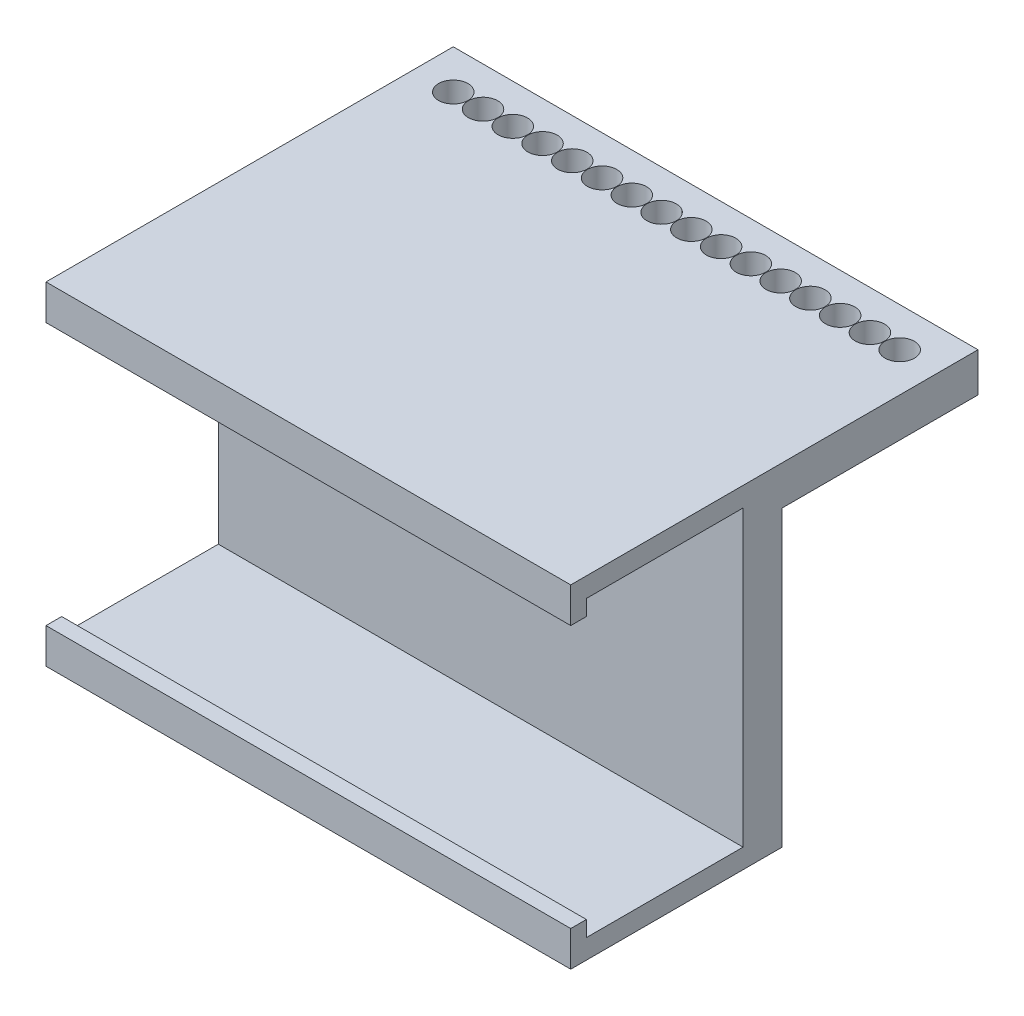
ISO-10303-21;
HEADER;
FILE_DESCRIPTION(('STEP AP214'),'2;1');
FILE_NAME('part.step','',(''),(''),'','','');
FILE_SCHEMA(('AUTOMOTIVE_DESIGN { 1 0 10303 214 1 1 1 1 }'));
ENDSEC;
DATA;
#1=APPLICATION_CONTEXT('core data for automotive mechanical design processes');
#2=APPLICATION_PROTOCOL_DEFINITION('international standard','automotive_design',2000,#1);
#3=PRODUCT_CONTEXT('',#1,'mechanical');
#4=PRODUCT('Part','Part','',(#3));
#5=PRODUCT_RELATED_PRODUCT_CATEGORY('part','',(#4));
#6=PRODUCT_DEFINITION_FORMATION('','',#4);
#7=PRODUCT_DEFINITION_CONTEXT('part definition',#1,'design');
#8=PRODUCT_DEFINITION('design','',#6,#7);
#9=PRODUCT_DEFINITION_SHAPE('','',#8);
#10=(LENGTH_UNIT() NAMED_UNIT(*) SI_UNIT(.MILLI.,.METRE.));
#11=(NAMED_UNIT(*) PLANE_ANGLE_UNIT() SI_UNIT($,.RADIAN.));
#12=(NAMED_UNIT(*) SI_UNIT($,.STERADIAN.) SOLID_ANGLE_UNIT());
#13=UNCERTAINTY_MEASURE_WITH_UNIT(LENGTH_MEASURE(1.E-05),#10,'distance_accuracy_value','');
#14=(GEOMETRIC_REPRESENTATION_CONTEXT(3) GLOBAL_UNCERTAINTY_ASSIGNED_CONTEXT((#13)) GLOBAL_UNIT_ASSIGNED_CONTEXT((#10,
#11,#12)) REPRESENTATION_CONTEXT('',''));
#15=CARTESIAN_POINT('',(0.,0.,0.));
#16=DIRECTION('',(0.,0.,1.));
#17=DIRECTION('',(1.,0.,0.));
#18=AXIS2_PLACEMENT_3D('',#15,#16,#17);
#19=CARTESIAN_POINT('',(-88.3816326530613,6.35,27.6678571428572));
#20=DIRECTION('',(0.,0.,-1.));
#21=DIRECTION('',(-1.,0.,0.));
#22=AXIS2_PLACEMENT_3D('',#19,#20,#21);
#23=PLANE('',#22);
#24=DIRECTION('',(-1.,0.,0.));
#25=VECTOR('',#24,1.);
#26=CARTESIAN_POINT('',(-88.3816326530613,-44.45,27.6678571428572));
#27=LINE('',#26,#25);
#28=CARTESIAN_POINT('',(-3.29163265306134,-44.45,27.6678571428572));
#29=VERTEX_POINT('',#28);
#30=CARTESIAN_POINT('',(-88.3816326530613,-44.45,27.6678571428572));
#31=VERTEX_POINT('',#30);
#32=EDGE_CURVE('E396',#29,#31,#27,.T.);
#33=ORIENTED_EDGE('',*,*,#32,.F.);
#34=DIRECTION('',(0.,-1.,0.));
#35=VECTOR('',#34,1.);
#36=CARTESIAN_POINT('',(-3.29163265306134,6.35,27.6678571428572));
#37=LINE('',#36,#35);
#38=CARTESIAN_POINT('',(-3.29163265306134,3.175,27.6678571428572));
#39=VERTEX_POINT('',#38);
#40=EDGE_CURVE('E48',#39,#29,#37,.T.);
#41=ORIENTED_EDGE('',*,*,#40,.F.);
#42=DIRECTION('',(1.,0.,0.));
#43=VECTOR('',#42,1.);
#44=CARTESIAN_POINT('',(-88.3816326530613,3.175,27.6678571428572));
#45=LINE('',#44,#43);
#46=CARTESIAN_POINT('',(-88.3816326530613,3.175,27.6678571428572));
#47=VERTEX_POINT('',#46);
#48=EDGE_CURVE('E171',#47,#39,#45,.T.);
#49=ORIENTED_EDGE('',*,*,#48,.F.);
#50=DIRECTION('',(0.,-1.,0.));
#51=VECTOR('',#50,1.);
#52=CARTESIAN_POINT('',(-88.3816326530613,6.35,27.6678571428572));
#53=LINE('',#52,#51);
#54=EDGE_CURVE('E11',#47,#31,#53,.T.);
#55=ORIENTED_EDGE('',*,*,#54,.T.);
#56=EDGE_LOOP('',(#33,#41,#49,#55));
#57=FACE_BOUND('',#56,.T.);
#58=ADVANCED_FACE('F39',(#57),#23,.F.);
#59=CARTESIAN_POINT('',(0.,0.,0.));
#60=DIRECTION('',(0.,1.,0.));
#61=DIRECTION('',(0.,0.,1.));
#62=AXIS2_PLACEMENT_3D('',#59,#60,#61);
#63=PLANE('',#62);
#64=CARTESIAN_POINT('',(-9.64163265306134,0.,-4.08214285714284));
#65=DIRECTION('',(0.,1.,0.));
#66=DIRECTION('',(0.,0.,1.));
#67=AXIS2_PLACEMENT_3D('',#64,#65,#66);
#68=CIRCLE('',#67,2.38125000000001);
#69=CARTESIAN_POINT('',(-9.64163265306134,0.,-1.70089285714283));
#70=VERTEX_POINT('',#69);
#71=EDGE_CURVE('E216',#70,#70,#68,.T.);
#72=ORIENTED_EDGE('',*,*,#71,.T.);
#73=EDGE_LOOP('',(#72));
#74=FACE_BOUND('',#73,.T.);
#75=CARTESIAN_POINT('',(-14.4676326530613,0.,-4.08214285714284));
#76=DIRECTION('',(0.,1.,0.));
#77=DIRECTION('',(0.,0.,1.));
#78=AXIS2_PLACEMENT_3D('',#75,#76,#77);
#79=CIRCLE('',#78,2.38125000000001);
#80=CARTESIAN_POINT('',(-14.4676326530613,0.,-1.70089285714283));
#81=VERTEX_POINT('',#80);
#82=EDGE_CURVE('E221',#81,#81,#79,.T.);
#83=ORIENTED_EDGE('',*,*,#82,.T.);
#84=EDGE_LOOP('',(#83));
#85=FACE_BOUND('',#84,.T.);
#86=CARTESIAN_POINT('',(-19.2936326530613,0.,-4.08214285714284));
#87=DIRECTION('',(0.,1.,0.));
#88=DIRECTION('',(0.,0.,1.));
#89=AXIS2_PLACEMENT_3D('',#86,#87,#88);
#90=CIRCLE('',#89,2.38125000000001);
#91=CARTESIAN_POINT('',(-19.2936326530613,0.,-1.70089285714283));
#92=VERTEX_POINT('',#91);
#93=EDGE_CURVE('E229',#92,#92,#90,.T.);
#94=ORIENTED_EDGE('',*,*,#93,.T.);
#95=EDGE_LOOP('',(#94));
#96=FACE_BOUND('',#95,.T.);
#97=CARTESIAN_POINT('',(-24.1196326530613,0.,-4.08214285714284));
#98=DIRECTION('',(0.,1.,0.));
#99=DIRECTION('',(0.,0.,1.));
#100=AXIS2_PLACEMENT_3D('',#97,#98,#99);
#101=CIRCLE('',#100,2.38125000000001);
#102=CARTESIAN_POINT('',(-24.1196326530613,0.,-1.70089285714283));
#103=VERTEX_POINT('',#102);
#104=EDGE_CURVE('E237',#103,#103,#101,.T.);
#105=ORIENTED_EDGE('',*,*,#104,.T.);
#106=EDGE_LOOP('',(#105));
#107=FACE_BOUND('',#106,.T.);
#108=CARTESIAN_POINT('',(-28.9456326530613,0.,-4.08214285714284));
#109=DIRECTION('',(0.,1.,0.));
#110=DIRECTION('',(0.,0.,1.));
#111=AXIS2_PLACEMENT_3D('',#108,#109,#110);
#112=CIRCLE('',#111,2.38125000000001);
#113=CARTESIAN_POINT('',(-28.9456326530613,0.,-1.70089285714283));
#114=VERTEX_POINT('',#113);
#115=EDGE_CURVE('E245',#114,#114,#112,.T.);
#116=ORIENTED_EDGE('',*,*,#115,.T.);
#117=EDGE_LOOP('',(#116));
#118=FACE_BOUND('',#117,.T.);
#119=CARTESIAN_POINT('',(-33.7716326530613,0.,-4.08214285714284));
#120=DIRECTION('',(0.,1.,0.));
#121=DIRECTION('',(0.,0.,1.));
#122=AXIS2_PLACEMENT_3D('',#119,#120,#121);
#123=CIRCLE('',#122,2.38125000000001);
#124=CARTESIAN_POINT('',(-33.7716326530613,0.,-1.70089285714283));
#125=VERTEX_POINT('',#124);
#126=EDGE_CURVE('E253',#125,#125,#123,.T.);
#127=ORIENTED_EDGE('',*,*,#126,.T.);
#128=EDGE_LOOP('',(#127));
#129=FACE_BOUND('',#128,.T.);
#130=CARTESIAN_POINT('',(-38.5976326530613,0.,-4.08214285714284));
#131=DIRECTION('',(0.,1.,0.));
#132=DIRECTION('',(0.,0.,1.));
#133=AXIS2_PLACEMENT_3D('',#130,#131,#132);
#134=CIRCLE('',#133,2.38125000000001);
#135=CARTESIAN_POINT('',(-38.5976326530613,0.,-1.70089285714283));
#136=VERTEX_POINT('',#135);
#137=EDGE_CURVE('E261',#136,#136,#134,.T.);
#138=ORIENTED_EDGE('',*,*,#137,.T.);
#139=EDGE_LOOP('',(#138));
#140=FACE_BOUND('',#139,.T.);
#141=CARTESIAN_POINT('',(-43.4236326530613,0.,-4.08214285714284));
#142=DIRECTION('',(0.,1.,0.));
#143=DIRECTION('',(0.,0.,1.));
#144=AXIS2_PLACEMENT_3D('',#141,#142,#143);
#145=CIRCLE('',#144,2.38125000000001);
#146=CARTESIAN_POINT('',(-43.4236326530613,0.,-1.70089285714283));
#147=VERTEX_POINT('',#146);
#148=EDGE_CURVE('E269',#147,#147,#145,.T.);
#149=ORIENTED_EDGE('',*,*,#148,.T.);
#150=EDGE_LOOP('',(#149));
#151=FACE_BOUND('',#150,.T.);
#152=CARTESIAN_POINT('',(-48.2496326530613,0.,-4.08214285714284));
#153=DIRECTION('',(0.,1.,0.));
#154=DIRECTION('',(0.,0.,1.));
#155=AXIS2_PLACEMENT_3D('',#152,#153,#154);
#156=CIRCLE('',#155,2.38125000000001);
#157=CARTESIAN_POINT('',(-48.2496326530613,0.,-1.70089285714283));
#158=VERTEX_POINT('',#157);
#159=EDGE_CURVE('E277',#158,#158,#156,.T.);
#160=ORIENTED_EDGE('',*,*,#159,.T.);
#161=EDGE_LOOP('',(#160));
#162=FACE_BOUND('',#161,.T.);
#163=CARTESIAN_POINT('',(-53.0756326530613,0.,-4.08214285714284));
#164=DIRECTION('',(0.,1.,0.));
#165=DIRECTION('',(0.,0.,1.));
#166=AXIS2_PLACEMENT_3D('',#163,#164,#165);
#167=CIRCLE('',#166,2.38125000000001);
#168=CARTESIAN_POINT('',(-53.0756326530613,0.,-1.70089285714283));
#169=VERTEX_POINT('',#168);
#170=EDGE_CURVE('E285',#169,#169,#167,.T.);
#171=ORIENTED_EDGE('',*,*,#170,.T.);
#172=EDGE_LOOP('',(#171));
#173=FACE_BOUND('',#172,.T.);
#174=CARTESIAN_POINT('',(-57.9016326530613,0.,-4.08214285714284));
#175=DIRECTION('',(0.,1.,0.));
#176=DIRECTION('',(0.,0.,1.));
#177=AXIS2_PLACEMENT_3D('',#174,#175,#176);
#178=CIRCLE('',#177,2.38125000000001);
#179=CARTESIAN_POINT('',(-57.9016326530613,0.,-1.70089285714283));
#180=VERTEX_POINT('',#179);
#181=EDGE_CURVE('E293',#180,#180,#178,.T.);
#182=ORIENTED_EDGE('',*,*,#181,.T.);
#183=EDGE_LOOP('',(#182));
#184=FACE_BOUND('',#183,.T.);
#185=CARTESIAN_POINT('',(-62.7276326530613,0.,-4.08214285714284));
#186=DIRECTION('',(0.,1.,0.));
#187=DIRECTION('',(0.,0.,1.));
#188=AXIS2_PLACEMENT_3D('',#185,#186,#187);
#189=CIRCLE('',#188,2.38125000000001);
#190=CARTESIAN_POINT('',(-62.7276326530613,0.,-1.70089285714283));
#191=VERTEX_POINT('',#190);
#192=EDGE_CURVE('E301',#191,#191,#189,.T.);
#193=ORIENTED_EDGE('',*,*,#192,.T.);
#194=EDGE_LOOP('',(#193));
#195=FACE_BOUND('',#194,.T.);
#196=CARTESIAN_POINT('',(-67.5536326530613,0.,-4.08214285714284));
#197=DIRECTION('',(0.,1.,0.));
#198=DIRECTION('',(0.,0.,1.));
#199=AXIS2_PLACEMENT_3D('',#196,#197,#198);
#200=CIRCLE('',#199,2.38125000000001);
#201=CARTESIAN_POINT('',(-67.5536326530613,0.,-1.70089285714283));
#202=VERTEX_POINT('',#201);
#203=EDGE_CURVE('E309',#202,#202,#200,.T.);
#204=ORIENTED_EDGE('',*,*,#203,.T.);
#205=EDGE_LOOP('',(#204));
#206=FACE_BOUND('',#205,.T.);
#207=CARTESIAN_POINT('',(-72.3796326530613,0.,-4.08214285714284));
#208=DIRECTION('',(0.,1.,0.));
#209=DIRECTION('',(0.,0.,1.));
#210=AXIS2_PLACEMENT_3D('',#207,#208,#209);
#211=CIRCLE('',#210,2.38125000000001);
#212=CARTESIAN_POINT('',(-72.3796326530613,0.,-1.70089285714283));
#213=VERTEX_POINT('',#212);
#214=EDGE_CURVE('E317',#213,#213,#211,.T.);
#215=ORIENTED_EDGE('',*,*,#214,.T.);
#216=EDGE_LOOP('',(#215));
#217=FACE_BOUND('',#216,.T.);
#218=CARTESIAN_POINT('',(-77.2056326530613,0.,-4.08214285714284));
#219=DIRECTION('',(0.,1.,0.));
#220=DIRECTION('',(0.,0.,1.));
#221=AXIS2_PLACEMENT_3D('',#218,#219,#220);
#222=CIRCLE('',#221,2.38125000000001);
#223=CARTESIAN_POINT('',(-77.2056326530613,0.,-1.70089285714283));
#224=VERTEX_POINT('',#223);
#225=EDGE_CURVE('E325',#224,#224,#222,.T.);
#226=ORIENTED_EDGE('',*,*,#225,.T.);
#227=EDGE_LOOP('',(#226));
#228=FACE_BOUND('',#227,.T.);
#229=CARTESIAN_POINT('',(-82.0316326530613,0.,-4.08214285714284));
#230=DIRECTION('',(0.,1.,0.));
#231=DIRECTION('',(0.,0.,1.));
#232=AXIS2_PLACEMENT_3D('',#229,#230,#231);
#233=CIRCLE('',#232,2.38125000000001);
#234=CARTESIAN_POINT('',(-82.0316326530613,0.,-1.70089285714283));
#235=VERTEX_POINT('',#234);
#236=EDGE_CURVE('E333',#235,#235,#233,.T.);
#237=ORIENTED_EDGE('',*,*,#236,.T.);
#238=EDGE_LOOP('',(#237));
#239=FACE_BOUND('',#238,.T.);
#240=DIRECTION('',(1.,0.,0.));
#241=VECTOR('',#240,1.);
#242=CARTESIAN_POINT('',(-88.3816326530613,0.,21.3178571428572));
#243=LINE('',#242,#241);
#244=CARTESIAN_POINT('',(-88.3816326530613,0.,21.3178571428571));
#245=VERTEX_POINT('',#244);
#246=CARTESIAN_POINT('',(-3.29163265306134,0.,21.3178571428572));
#247=VERTEX_POINT('',#246);
#248=EDGE_CURVE('E63',#245,#247,#243,.T.);
#249=ORIENTED_EDGE('',*,*,#248,.F.);
#250=DIRECTION('',(0.,0.,1.));
#251=VECTOR('',#250,1.);
#252=CARTESIAN_POINT('',(-88.3816326530613,0.,-10.4321428571428));
#253=LINE('',#252,#251);
#254=CARTESIAN_POINT('',(-88.3816326530613,0.,-10.4321428571428));
#255=VERTEX_POINT('',#254);
#256=EDGE_CURVE('E341',#255,#245,#253,.T.);
#257=ORIENTED_EDGE('',*,*,#256,.F.);
#258=DIRECTION('',(-1.,0.,0.));
#259=VECTOR('',#258,1.);
#260=CARTESIAN_POINT('',(-88.3816326530613,0.,-10.4321428571428));
#261=LINE('',#260,#259);
#262=CARTESIAN_POINT('',(-3.29163265306134,0.,-10.4321428571428));
#263=VERTEX_POINT('',#262);
#264=EDGE_CURVE('E349',#263,#255,#261,.T.);
#265=ORIENTED_EDGE('',*,*,#264,.F.);
#266=DIRECTION('',(0.,0.,-1.));
#267=VECTOR('',#266,1.);
#268=CARTESIAN_POINT('',(-3.29163265306134,0.,-10.4321428571428));
#269=LINE('',#268,#267);
#270=EDGE_CURVE('E358',#247,#263,#269,.T.);
#271=ORIENTED_EDGE('',*,*,#270,.F.);
#272=EDGE_LOOP('',(#249,#257,#265,#271));
#273=FACE_BOUND('',#272,.T.);
#274=ADVANCED_FACE('F376',(#74,#85,#96,#107,#118,#129,#140,#151,#162,#173,#184,#195,#206,#217,
#228,#239,#273),#63,.F.);
#275=CARTESIAN_POINT('',(0.,6.35,0.));
#276=DIRECTION('',(0.,1.,0.));
#277=DIRECTION('',(0.,0.,1.));
#278=AXIS2_PLACEMENT_3D('',#275,#276,#277);
#279=PLANE('',#278);
#280=CARTESIAN_POINT('',(-14.4676326530613,6.35,-4.08214285714284));
#281=DIRECTION('',(0.,1.,0.));
#282=DIRECTION('',(0.,0.,1.));
#283=AXIS2_PLACEMENT_3D('',#280,#281,#282);
#284=CIRCLE('',#283,2.38125000000001);
#285=CARTESIAN_POINT('',(-14.4676326530613,6.35,-1.70089285714283));
#286=VERTEX_POINT('',#285);
#287=EDGE_CURVE('E225',#286,#286,#284,.T.);
#288=ORIENTED_EDGE('',*,*,#287,.F.);
#289=EDGE_LOOP('',(#288));
#290=FACE_BOUND('',#289,.T.);
#291=CARTESIAN_POINT('',(-24.1196326530613,6.35,-4.08214285714284));
#292=DIRECTION('',(0.,1.,0.));
#293=DIRECTION('',(0.,0.,1.));
#294=AXIS2_PLACEMENT_3D('',#291,#292,#293);
#295=CIRCLE('',#294,2.38125000000001);
#296=CARTESIAN_POINT('',(-24.1196326530613,6.35,-1.70089285714283));
#297=VERTEX_POINT('',#296);
#298=EDGE_CURVE('E241',#297,#297,#295,.T.);
#299=ORIENTED_EDGE('',*,*,#298,.F.);
#300=EDGE_LOOP('',(#299));
#301=FACE_BOUND('',#300,.T.);
#302=CARTESIAN_POINT('',(-33.7716326530613,6.35,-4.08214285714284));
#303=DIRECTION('',(0.,1.,0.));
#304=DIRECTION('',(0.,0.,1.));
#305=AXIS2_PLACEMENT_3D('',#302,#303,#304);
#306=CIRCLE('',#305,2.38125000000001);
#307=CARTESIAN_POINT('',(-33.7716326530613,6.35,-1.70089285714283));
#308=VERTEX_POINT('',#307);
#309=EDGE_CURVE('E257',#308,#308,#306,.T.);
#310=ORIENTED_EDGE('',*,*,#309,.F.);
#311=EDGE_LOOP('',(#310));
#312=FACE_BOUND('',#311,.T.);
#313=CARTESIAN_POINT('',(-43.4236326530613,6.35,-4.08214285714284));
#314=DIRECTION('',(0.,1.,0.));
#315=DIRECTION('',(0.,0.,1.));
#316=AXIS2_PLACEMENT_3D('',#313,#314,#315);
#317=CIRCLE('',#316,2.38125000000001);
#318=CARTESIAN_POINT('',(-43.4236326530613,6.35,-1.70089285714283));
#319=VERTEX_POINT('',#318);
#320=EDGE_CURVE('E273',#319,#319,#317,.T.);
#321=ORIENTED_EDGE('',*,*,#320,.F.);
#322=EDGE_LOOP('',(#321));
#323=FACE_BOUND('',#322,.T.);
#324=CARTESIAN_POINT('',(-53.0756326530613,6.35,-4.08214285714284));
#325=DIRECTION('',(0.,1.,0.));
#326=DIRECTION('',(0.,0.,1.));
#327=AXIS2_PLACEMENT_3D('',#324,#325,#326);
#328=CIRCLE('',#327,2.38125000000001);
#329=CARTESIAN_POINT('',(-53.0756326530613,6.35,-1.70089285714283));
#330=VERTEX_POINT('',#329);
#331=EDGE_CURVE('E289',#330,#330,#328,.T.);
#332=ORIENTED_EDGE('',*,*,#331,.F.);
#333=EDGE_LOOP('',(#332));
#334=FACE_BOUND('',#333,.T.);
#335=CARTESIAN_POINT('',(-62.7276326530613,6.35,-4.08214285714284));
#336=DIRECTION('',(0.,1.,0.));
#337=DIRECTION('',(0.,0.,1.));
#338=AXIS2_PLACEMENT_3D('',#335,#336,#337);
#339=CIRCLE('',#338,2.38125000000001);
#340=CARTESIAN_POINT('',(-62.7276326530613,6.35,-1.70089285714283));
#341=VERTEX_POINT('',#340);
#342=EDGE_CURVE('E305',#341,#341,#339,.T.);
#343=ORIENTED_EDGE('',*,*,#342,.F.);
#344=EDGE_LOOP('',(#343));
#345=FACE_BOUND('',#344,.T.);
#346=CARTESIAN_POINT('',(-72.3796326530613,6.35,-4.08214285714284));
#347=DIRECTION('',(0.,1.,0.));
#348=DIRECTION('',(0.,0.,1.));
#349=AXIS2_PLACEMENT_3D('',#346,#347,#348);
#350=CIRCLE('',#349,2.38125000000001);
#351=CARTESIAN_POINT('',(-72.3796326530613,6.35,-1.70089285714283));
#352=VERTEX_POINT('',#351);
#353=EDGE_CURVE('E321',#352,#352,#350,.T.);
#354=ORIENTED_EDGE('',*,*,#353,.F.);
#355=EDGE_LOOP('',(#354));
#356=FACE_BOUND('',#355,.T.);
#357=CARTESIAN_POINT('',(-82.0316326530613,6.35,-4.08214285714284));
#358=DIRECTION('',(0.,1.,0.));
#359=DIRECTION('',(0.,0.,1.));
#360=AXIS2_PLACEMENT_3D('',#357,#358,#359);
#361=CIRCLE('',#360,2.38125000000001);
#362=CARTESIAN_POINT('',(-82.0316326530613,6.35,-1.70089285714283));
#363=VERTEX_POINT('',#362);
#364=EDGE_CURVE('E337',#363,#363,#361,.T.);
#365=ORIENTED_EDGE('',*,*,#364,.F.);
#366=EDGE_LOOP('',(#365));
#367=FACE_BOUND('',#366,.T.);
#368=DIRECTION('',(0.,0.,1.));
#369=VECTOR('',#368,1.);
#370=CARTESIAN_POINT('',(-88.3816326530613,6.35,-10.4321428571428));
#371=LINE('',#370,#369);
#372=CARTESIAN_POINT('',(-88.3816326530613,6.35,-10.4321428571428));
#373=VERTEX_POINT('',#372);
#374=CARTESIAN_POINT('',(-88.3816326530613,6.35,55.6078571428572));
#375=VERTEX_POINT('',#374);
#376=EDGE_CURVE('E345',#373,#375,#371,.T.);
#377=ORIENTED_EDGE('',*,*,#376,.T.);
#378=DIRECTION('',(-1.,0.,0.));
#379=VECTOR('',#378,1.);
#380=CARTESIAN_POINT('',(-88.3816326530613,6.35,55.6078571428572));
#381=LINE('',#380,#379);
#382=CARTESIAN_POINT('',(-3.29163265306134,6.35,55.6078571428572));
#383=VERTEX_POINT('',#382);
#384=EDGE_CURVE('E187',#383,#375,#381,.T.);
#385=ORIENTED_EDGE('',*,*,#384,.F.);
#386=DIRECTION('',(0.,0.,-1.));
#387=VECTOR('',#386,1.);
#388=CARTESIAN_POINT('',(-3.29163265306134,6.35,-10.4321428571428));
#389=LINE('',#388,#387);
#390=CARTESIAN_POINT('',(-3.29163265306134,6.35,-10.4321428571428));
#391=VERTEX_POINT('',#390);
#392=EDGE_CURVE('E348',#383,#391,#389,.T.);
#393=ORIENTED_EDGE('',*,*,#392,.T.);
#394=DIRECTION('',(-1.,0.,0.));
#395=VECTOR('',#394,1.);
#396=CARTESIAN_POINT('',(-88.3816326530613,6.35,-10.4321428571428));
#397=LINE('',#396,#395);
#398=EDGE_CURVE('E352',#391,#373,#397,.T.);
#399=ORIENTED_EDGE('',*,*,#398,.T.);
#400=EDGE_LOOP('',(#377,#385,#393,#399));
#401=FACE_BOUND('',#400,.T.);
#402=CARTESIAN_POINT('',(-77.2056326530613,6.35,-4.08214285714284));
#403=DIRECTION('',(0.,1.,0.));
#404=DIRECTION('',(0.,0.,1.));
#405=AXIS2_PLACEMENT_3D('',#402,#403,#404);
#406=CIRCLE('',#405,2.38125000000001);
#407=CARTESIAN_POINT('',(-77.2056326530613,6.35,-1.70089285714283));
#408=VERTEX_POINT('',#407);
#409=EDGE_CURVE('E329',#408,#408,#406,.T.);
#410=ORIENTED_EDGE('',*,*,#409,.F.);
#411=EDGE_LOOP('',(#410));
#412=FACE_BOUND('',#411,.T.);
#413=CARTESIAN_POINT('',(-67.5536326530613,6.35,-4.08214285714284));
#414=DIRECTION('',(0.,1.,0.));
#415=DIRECTION('',(0.,0.,1.));
#416=AXIS2_PLACEMENT_3D('',#413,#414,#415);
#417=CIRCLE('',#416,2.38125000000001);
#418=CARTESIAN_POINT('',(-67.5536326530613,6.35,-1.70089285714283));
#419=VERTEX_POINT('',#418);
#420=EDGE_CURVE('E313',#419,#419,#417,.T.);
#421=ORIENTED_EDGE('',*,*,#420,.F.);
#422=EDGE_LOOP('',(#421));
#423=FACE_BOUND('',#422,.T.);
#424=CARTESIAN_POINT('',(-57.9016326530613,6.35,-4.08214285714284));
#425=DIRECTION('',(0.,1.,0.));
#426=DIRECTION('',(0.,0.,1.));
#427=AXIS2_PLACEMENT_3D('',#424,#425,#426);
#428=CIRCLE('',#427,2.38125000000001);
#429=CARTESIAN_POINT('',(-57.9016326530613,6.35,-1.70089285714283));
#430=VERTEX_POINT('',#429);
#431=EDGE_CURVE('E297',#430,#430,#428,.T.);
#432=ORIENTED_EDGE('',*,*,#431,.F.);
#433=EDGE_LOOP('',(#432));
#434=FACE_BOUND('',#433,.T.);
#435=CARTESIAN_POINT('',(-48.2496326530613,6.35,-4.08214285714284));
#436=DIRECTION('',(0.,1.,0.));
#437=DIRECTION('',(0.,0.,1.));
#438=AXIS2_PLACEMENT_3D('',#435,#436,#437);
#439=CIRCLE('',#438,2.38125000000001);
#440=CARTESIAN_POINT('',(-48.2496326530613,6.35,-1.70089285714283));
#441=VERTEX_POINT('',#440);
#442=EDGE_CURVE('E281',#441,#441,#439,.T.);
#443=ORIENTED_EDGE('',*,*,#442,.F.);
#444=EDGE_LOOP('',(#443));
#445=FACE_BOUND('',#444,.T.);
#446=CARTESIAN_POINT('',(-38.5976326530613,6.35,-4.08214285714284));
#447=DIRECTION('',(0.,1.,0.));
#448=DIRECTION('',(0.,0.,1.));
#449=AXIS2_PLACEMENT_3D('',#446,#447,#448);
#450=CIRCLE('',#449,2.38125000000001);
#451=CARTESIAN_POINT('',(-38.5976326530613,6.35,-1.70089285714283));
#452=VERTEX_POINT('',#451);
#453=EDGE_CURVE('E265',#452,#452,#450,.T.);
#454=ORIENTED_EDGE('',*,*,#453,.F.);
#455=EDGE_LOOP('',(#454));
#456=FACE_BOUND('',#455,.T.);
#457=CARTESIAN_POINT('',(-28.9456326530613,6.35,-4.08214285714284));
#458=DIRECTION('',(0.,1.,0.));
#459=DIRECTION('',(0.,0.,1.));
#460=AXIS2_PLACEMENT_3D('',#457,#458,#459);
#461=CIRCLE('',#460,2.38125000000001);
#462=CARTESIAN_POINT('',(-28.9456326530613,6.35,-1.70089285714283));
#463=VERTEX_POINT('',#462);
#464=EDGE_CURVE('E249',#463,#463,#461,.T.);
#465=ORIENTED_EDGE('',*,*,#464,.F.);
#466=EDGE_LOOP('',(#465));
#467=FACE_BOUND('',#466,.T.);
#468=CARTESIAN_POINT('',(-19.2936326530613,6.35,-4.08214285714284));
#469=DIRECTION('',(0.,1.,0.));
#470=DIRECTION('',(0.,0.,1.));
#471=AXIS2_PLACEMENT_3D('',#468,#469,#470);
#472=CIRCLE('',#471,2.38125000000001);
#473=CARTESIAN_POINT('',(-19.2936326530613,6.35,-1.70089285714283));
#474=VERTEX_POINT('',#473);
#475=EDGE_CURVE('E233',#474,#474,#472,.T.);
#476=ORIENTED_EDGE('',*,*,#475,.F.);
#477=EDGE_LOOP('',(#476));
#478=FACE_BOUND('',#477,.T.);
#479=CARTESIAN_POINT('',(-9.64163265306134,6.35,-4.08214285714284));
#480=DIRECTION('',(0.,1.,0.));
#481=DIRECTION('',(0.,0.,1.));
#482=AXIS2_PLACEMENT_3D('',#479,#480,#481);
#483=CIRCLE('',#482,2.38125000000001);
#484=CARTESIAN_POINT('',(-9.64163265306134,6.35,-1.70089285714283));
#485=VERTEX_POINT('',#484);
#486=EDGE_CURVE('E217',#485,#485,#483,.T.);
#487=ORIENTED_EDGE('',*,*,#486,.F.);
#488=EDGE_LOOP('',(#487));
#489=FACE_BOUND('',#488,.T.);
#490=ADVANCED_FACE('F460',(#290,#301,#312,#323,#334,#345,#356,#367,#401,#412,#423,#434,#445,
#456,#467,#478,#489),#279,.T.);
#491=CARTESIAN_POINT('',(-88.3816326530613,6.35,-10.4321428571428));
#492=DIRECTION('',(1.,0.,0.));
#493=DIRECTION('',(0.,0.,-1.));
#494=AXIS2_PLACEMENT_3D('',#491,#492,#493);
#495=PLANE('',#494);
#496=ORIENTED_EDGE('',*,*,#256,.T.);
#497=DIRECTION('',(0.,1.,0.));
#498=VECTOR('',#497,1.);
#499=CARTESIAN_POINT('',(-88.3816326530613,-47.625,21.3178571428572));
#500=LINE('',#499,#498);
#501=CARTESIAN_POINT('',(-88.3816326530613,-47.625,21.3178571428572));
#502=VERTEX_POINT('',#501);
#503=EDGE_CURVE('E212',#502,#245,#500,.T.);
#504=ORIENTED_EDGE('',*,*,#503,.F.);
#505=DIRECTION('',(0.,0.,-1.));
#506=VECTOR('',#505,1.);
#507=CARTESIAN_POINT('',(-88.3816326530613,-47.625,27.6678571428572));
#508=LINE('',#507,#506);
#509=CARTESIAN_POINT('',(-88.3816326530613,-47.625,55.6078571428572));
#510=VERTEX_POINT('',#509);
#511=EDGE_CURVE('E196',#510,#502,#508,.T.);
#512=ORIENTED_EDGE('',*,*,#511,.F.);
#513=DIRECTION('',(0.,-1.,0.));
#514=VECTOR('',#513,1.);
#515=CARTESIAN_POINT('',(-88.3816326530613,-47.625,55.6078571428572));
#516=LINE('',#515,#514);
#517=CARTESIAN_POINT('',(-88.3816326530613,-41.91,55.6078571428572));
#518=VERTEX_POINT('',#517);
#519=EDGE_CURVE('E390',#518,#510,#516,.T.);
#520=ORIENTED_EDGE('',*,*,#519,.F.);
#521=DIRECTION('',(0.,0.,-1.));
#522=VECTOR('',#521,1.);
#523=CARTESIAN_POINT('',(-88.3816326530613,-41.91,55.6078571428572));
#524=LINE('',#523,#522);
#525=CARTESIAN_POINT('',(-88.3816326530613,-41.91,53.0678571428572));
#526=VERTEX_POINT('',#525);
#527=EDGE_CURVE('E392',#518,#526,#524,.T.);
#528=ORIENTED_EDGE('',*,*,#527,.T.);
#529=DIRECTION('',(0.,-1.,0.));
#530=VECTOR('',#529,1.);
#531=CARTESIAN_POINT('',(-88.3816326530613,-44.45,53.0678571428572));
#532=LINE('',#531,#530);
#533=CARTESIAN_POINT('',(-88.3816326530613,-44.45,53.0678571428572));
#534=VERTEX_POINT('',#533);
#535=EDGE_CURVE('E404',#526,#534,#532,.T.);
#536=ORIENTED_EDGE('',*,*,#535,.T.);
#537=DIRECTION('',(0.,0.,-1.));
#538=VECTOR('',#537,1.);
#539=CARTESIAN_POINT('',(-88.3816326530613,-44.45,55.6078571428572));
#540=LINE('',#539,#538);
#541=EDGE_CURVE('E164',#534,#31,#540,.T.);
#542=ORIENTED_EDGE('',*,*,#541,.T.);
#543=ORIENTED_EDGE('',*,*,#54,.F.);
#544=DIRECTION('',(0.,0.,-1.));
#545=VECTOR('',#544,1.);
#546=CARTESIAN_POINT('',(-88.3816326530613,3.175,55.6078571428572));
#547=LINE('',#546,#545);
#548=CARTESIAN_POINT('',(-88.3816326530613,3.175,53.0678571428572));
#549=VERTEX_POINT('',#548);
#550=EDGE_CURVE('E55',#549,#47,#547,.T.);
#551=ORIENTED_EDGE('',*,*,#550,.F.);
#552=DIRECTION('',(0.,-1.,0.));
#553=VECTOR('',#552,1.);
#554=CARTESIAN_POINT('',(-88.3816326530613,3.175,53.0678571428572));
#555=LINE('',#554,#553);
#556=CARTESIAN_POINT('',(-88.3816326530613,0.634999999999999,53.0678571428572));
#557=VERTEX_POINT('',#556);
#558=EDGE_CURVE('E416',#549,#557,#555,.T.);
#559=ORIENTED_EDGE('',*,*,#558,.T.);
#560=DIRECTION('',(0.,0.,1.));
#561=VECTOR('',#560,1.);
#562=CARTESIAN_POINT('',(-88.3816326530613,0.634999999999999,55.6078571428572));
#563=LINE('',#562,#561);
#564=CARTESIAN_POINT('',(-88.3816326530613,0.634999999999999,55.6078571428572));
#565=VERTEX_POINT('',#564);
#566=EDGE_CURVE('E419',#557,#565,#563,.T.);
#567=ORIENTED_EDGE('',*,*,#566,.T.);
#568=DIRECTION('',(0.,-1.,0.));
#569=VECTOR('',#568,1.);
#570=CARTESIAN_POINT('',(-88.3816326530613,6.35,55.6078571428572));
#571=LINE('',#570,#569);
#572=EDGE_CURVE('E175',#375,#565,#571,.T.);
#573=ORIENTED_EDGE('',*,*,#572,.F.);
#574=ORIENTED_EDGE('',*,*,#376,.F.);
#575=DIRECTION('',(0.,-1.,0.));
#576=VECTOR('',#575,1.);
#577=CARTESIAN_POINT('',(-88.3816326530613,6.35,-10.4321428571428));
#578=LINE('',#577,#576);
#579=EDGE_CURVE('E355',#373,#255,#578,.T.);
#580=ORIENTED_EDGE('',*,*,#579,.T.);
#581=EDGE_LOOP('',(#496,#504,#512,#520,#528,#536,#542,#543,#551,#559,#567,#573,#574,#580));
#582=FACE_BOUND('',#581,.T.);
#583=ADVANCED_FACE('F41',(#582),#495,.F.);
#584=CARTESIAN_POINT('',(-3.29163265306134,6.35,-10.4321428571428));
#585=DIRECTION('',(-1.,0.,0.));
#586=DIRECTION('',(0.,0.,1.));
#587=AXIS2_PLACEMENT_3D('',#584,#585,#586);
#588=PLANE('',#587);
#589=ORIENTED_EDGE('',*,*,#392,.F.);
#590=DIRECTION('',(0.,1.,0.));
#591=VECTOR('',#590,1.);
#592=CARTESIAN_POINT('',(-3.29163265306134,6.35,55.6078571428572));
#593=LINE('',#592,#591);
#594=CARTESIAN_POINT('',(-3.29163265306132,0.634999999999999,55.6078571428572));
#595=VERTEX_POINT('',#594);
#596=EDGE_CURVE('E183',#595,#383,#593,.T.);
#597=ORIENTED_EDGE('',*,*,#596,.F.);
#598=DIRECTION('',(0.,0.,-1.));
#599=VECTOR('',#598,1.);
#600=CARTESIAN_POINT('',(-3.29163265306132,0.634999999999999,55.6078571428572));
#601=LINE('',#600,#599);
#602=CARTESIAN_POINT('',(-3.29163265306132,0.634999999999999,53.0678571428572));
#603=VERTEX_POINT('',#602);
#604=EDGE_CURVE('E403',#595,#603,#601,.T.);
#605=ORIENTED_EDGE('',*,*,#604,.T.);
#606=DIRECTION('',(0.,1.,0.));
#607=VECTOR('',#606,1.);
#608=CARTESIAN_POINT('',(-3.29163265306132,3.175,53.0678571428572));
#609=LINE('',#608,#607);
#610=CARTESIAN_POINT('',(-3.29163265306132,3.175,53.0678571428572));
#611=VERTEX_POINT('',#610);
#612=EDGE_CURVE('E424',#603,#611,#609,.T.);
#613=ORIENTED_EDGE('',*,*,#612,.T.);
#614=DIRECTION('',(0.,0.,-1.));
#615=VECTOR('',#614,1.);
#616=CARTESIAN_POINT('',(-3.29163265306134,3.175,55.6078571428572));
#617=LINE('',#616,#615);
#618=EDGE_CURVE('E190',#611,#39,#617,.T.);
#619=ORIENTED_EDGE('',*,*,#618,.T.);
#620=ORIENTED_EDGE('',*,*,#40,.T.);
#621=DIRECTION('',(0.,0.,-1.));
#622=VECTOR('',#621,1.);
#623=CARTESIAN_POINT('',(-3.29163265306134,-44.45,55.6078571428572));
#624=LINE('',#623,#622);
#625=CARTESIAN_POINT('',(-3.29163265306132,-44.45,53.0678571428572));
#626=VERTEX_POINT('',#625);
#627=EDGE_CURVE('E162',#626,#29,#624,.T.);
#628=ORIENTED_EDGE('',*,*,#627,.F.);
#629=DIRECTION('',(0.,1.,0.));
#630=VECTOR('',#629,1.);
#631=CARTESIAN_POINT('',(-3.29163265306132,-44.45,53.0678571428572));
#632=LINE('',#631,#630);
#633=CARTESIAN_POINT('',(-3.29163265306132,-41.91,53.0678571428572));
#634=VERTEX_POINT('',#633);
#635=EDGE_CURVE('E144',#626,#634,#632,.T.);
#636=ORIENTED_EDGE('',*,*,#635,.T.);
#637=DIRECTION('',(0.,0.,1.));
#638=VECTOR('',#637,1.);
#639=CARTESIAN_POINT('',(-3.29163265306132,-41.91,55.6078571428572));
#640=LINE('',#639,#638);
#641=CARTESIAN_POINT('',(-3.29163265306132,-41.91,55.6078571428572));
#642=VERTEX_POINT('',#641);
#643=EDGE_CURVE('E157',#634,#642,#640,.T.);
#644=ORIENTED_EDGE('',*,*,#643,.T.);
#645=DIRECTION('',(0.,1.,0.));
#646=VECTOR('',#645,1.);
#647=CARTESIAN_POINT('',(-3.29163265306134,-47.625,55.6078571428572));
#648=LINE('',#647,#646);
#649=CARTESIAN_POINT('',(-3.29163265306134,-47.625,55.6078571428572));
#650=VERTEX_POINT('',#649);
#651=EDGE_CURVE('E177',#650,#642,#648,.T.);
#652=ORIENTED_EDGE('',*,*,#651,.F.);
#653=DIRECTION('',(0.,0.,1.));
#654=VECTOR('',#653,1.);
#655=CARTESIAN_POINT('',(-3.29163265306134,-47.625,27.6678571428572));
#656=LINE('',#655,#654);
#657=CARTESIAN_POINT('',(-3.29163265306134,-47.625,21.3178571428572));
#658=VERTEX_POINT('',#657);
#659=EDGE_CURVE('E203',#658,#650,#656,.T.);
#660=ORIENTED_EDGE('',*,*,#659,.F.);
#661=DIRECTION('',(0.,1.,0.));
#662=VECTOR('',#661,1.);
#663=CARTESIAN_POINT('',(-3.29163265306134,-47.625,21.3178571428572));
#664=LINE('',#663,#662);
#665=EDGE_CURVE('E206',#658,#247,#664,.T.);
#666=ORIENTED_EDGE('',*,*,#665,.T.);
#667=ORIENTED_EDGE('',*,*,#270,.T.);
#668=DIRECTION('',(0.,-1.,0.));
#669=VECTOR('',#668,1.);
#670=CARTESIAN_POINT('',(-3.29163265306134,6.35,-10.4321428571428));
#671=LINE('',#670,#669);
#672=EDGE_CURVE('E366',#391,#263,#671,.T.);
#673=ORIENTED_EDGE('',*,*,#672,.F.);
#674=EDGE_LOOP('',(#589,#597,#605,#613,#619,#620,#628,#636,#644,#652,#660,#666,#667,#673));
#675=FACE_BOUND('',#674,.T.);
#676=ADVANCED_FACE('F168',(#675),#588,.F.);
#677=CARTESIAN_POINT('',(-88.3816326530613,6.35,-10.4321428571428));
#678=DIRECTION('',(0.,0.,1.));
#679=DIRECTION('',(1.,0.,0.));
#680=AXIS2_PLACEMENT_3D('',#677,#678,#679);
#681=PLANE('',#680);
#682=ORIENTED_EDGE('',*,*,#264,.T.);
#683=ORIENTED_EDGE('',*,*,#579,.F.);
#684=ORIENTED_EDGE('',*,*,#398,.F.);
#685=ORIENTED_EDGE('',*,*,#672,.T.);
#686=EDGE_LOOP('',(#682,#683,#684,#685));
#687=FACE_BOUND('',#686,.T.);
#688=ADVANCED_FACE('F374',(#687),#681,.F.);
#689=CARTESIAN_POINT('',(-82.0316326530613,6.35,-4.08214285714284));
#690=DIRECTION('',(0.,-1.,0.));
#691=DIRECTION('',(0.,0.,-1.));
#692=AXIS2_PLACEMENT_3D('',#689,#690,#691);
#693=CYLINDRICAL_SURFACE('',#692,2.38125000000001);
#694=ORIENTED_EDGE('',*,*,#364,.T.);
#695=EDGE_LOOP('',(#694));
#696=FACE_BOUND('',#695,.T.);
#697=ORIENTED_EDGE('',*,*,#236,.F.);
#698=EDGE_LOOP('',(#697));
#699=FACE_BOUND('',#698,.T.);
#700=ADVANCED_FACE('F482',(#696,#699),#693,.F.);
#701=CARTESIAN_POINT('',(-77.2056326530613,6.35,-4.08214285714284));
#702=DIRECTION('',(0.,-1.,0.));
#703=DIRECTION('',(0.,0.,-1.));
#704=AXIS2_PLACEMENT_3D('',#701,#702,#703);
#705=CYLINDRICAL_SURFACE('',#704,2.38125000000001);
#706=ORIENTED_EDGE('',*,*,#409,.T.);
#707=EDGE_LOOP('',(#706));
#708=FACE_BOUND('',#707,.T.);
#709=ORIENTED_EDGE('',*,*,#225,.F.);
#710=EDGE_LOOP('',(#709));
#711=FACE_BOUND('',#710,.T.);
#712=ADVANCED_FACE('F489',(#708,#711),#705,.F.);
#713=CARTESIAN_POINT('',(-72.3796326530613,6.35,-4.08214285714284));
#714=DIRECTION('',(0.,-1.,0.));
#715=DIRECTION('',(0.,0.,-1.));
#716=AXIS2_PLACEMENT_3D('',#713,#714,#715);
#717=CYLINDRICAL_SURFACE('',#716,2.38125000000001);
#718=ORIENTED_EDGE('',*,*,#353,.T.);
#719=EDGE_LOOP('',(#718));
#720=FACE_BOUND('',#719,.T.);
#721=ORIENTED_EDGE('',*,*,#214,.F.);
#722=EDGE_LOOP('',(#721));
#723=FACE_BOUND('',#722,.T.);
#724=ADVANCED_FACE('F493',(#720,#723),#717,.F.);
#725=CARTESIAN_POINT('',(-67.5536326530613,6.35,-4.08214285714284));
#726=DIRECTION('',(0.,-1.,0.));
#727=DIRECTION('',(0.,0.,-1.));
#728=AXIS2_PLACEMENT_3D('',#725,#726,#727);
#729=CYLINDRICAL_SURFACE('',#728,2.38125000000001);
#730=ORIENTED_EDGE('',*,*,#420,.T.);
#731=EDGE_LOOP('',(#730));
#732=FACE_BOUND('',#731,.T.);
#733=ORIENTED_EDGE('',*,*,#203,.F.);
#734=EDGE_LOOP('',(#733));
#735=FACE_BOUND('',#734,.T.);
#736=ADVANCED_FACE('F497',(#732,#735),#729,.F.);
#737=CARTESIAN_POINT('',(-62.7276326530613,6.35,-4.08214285714284));
#738=DIRECTION('',(0.,-1.,0.));
#739=DIRECTION('',(0.,0.,-1.));
#740=AXIS2_PLACEMENT_3D('',#737,#738,#739);
#741=CYLINDRICAL_SURFACE('',#740,2.38125000000001);
#742=ORIENTED_EDGE('',*,*,#342,.T.);
#743=EDGE_LOOP('',(#742));
#744=FACE_BOUND('',#743,.T.);
#745=ORIENTED_EDGE('',*,*,#192,.F.);
#746=EDGE_LOOP('',(#745));
#747=FACE_BOUND('',#746,.T.);
#748=ADVANCED_FACE('F501',(#744,#747),#741,.F.);
#749=CARTESIAN_POINT('',(-57.9016326530613,6.35,-4.08214285714284));
#750=DIRECTION('',(0.,-1.,0.));
#751=DIRECTION('',(0.,0.,-1.));
#752=AXIS2_PLACEMENT_3D('',#749,#750,#751);
#753=CYLINDRICAL_SURFACE('',#752,2.38125000000001);
#754=ORIENTED_EDGE('',*,*,#431,.T.);
#755=EDGE_LOOP('',(#754));
#756=FACE_BOUND('',#755,.T.);
#757=ORIENTED_EDGE('',*,*,#181,.F.);
#758=EDGE_LOOP('',(#757));
#759=FACE_BOUND('',#758,.T.);
#760=ADVANCED_FACE('F505',(#756,#759),#753,.F.);
#761=CARTESIAN_POINT('',(-53.0756326530613,6.35,-4.08214285714284));
#762=DIRECTION('',(0.,-1.,0.));
#763=DIRECTION('',(0.,0.,-1.));
#764=AXIS2_PLACEMENT_3D('',#761,#762,#763);
#765=CYLINDRICAL_SURFACE('',#764,2.38125000000001);
#766=ORIENTED_EDGE('',*,*,#331,.T.);
#767=EDGE_LOOP('',(#766));
#768=FACE_BOUND('',#767,.T.);
#769=ORIENTED_EDGE('',*,*,#170,.F.);
#770=EDGE_LOOP('',(#769));
#771=FACE_BOUND('',#770,.T.);
#772=ADVANCED_FACE('F509',(#768,#771),#765,.F.);
#773=CARTESIAN_POINT('',(-48.2496326530613,6.35,-4.08214285714284));
#774=DIRECTION('',(0.,-1.,0.));
#775=DIRECTION('',(0.,0.,-1.));
#776=AXIS2_PLACEMENT_3D('',#773,#774,#775);
#777=CYLINDRICAL_SURFACE('',#776,2.38125000000001);
#778=ORIENTED_EDGE('',*,*,#442,.T.);
#779=EDGE_LOOP('',(#778));
#780=FACE_BOUND('',#779,.T.);
#781=ORIENTED_EDGE('',*,*,#159,.F.);
#782=EDGE_LOOP('',(#781));
#783=FACE_BOUND('',#782,.T.);
#784=ADVANCED_FACE('F513',(#780,#783),#777,.F.);
#785=CARTESIAN_POINT('',(-43.4236326530613,6.35,-4.08214285714284));
#786=DIRECTION('',(0.,-1.,0.));
#787=DIRECTION('',(0.,0.,-1.));
#788=AXIS2_PLACEMENT_3D('',#785,#786,#787);
#789=CYLINDRICAL_SURFACE('',#788,2.38125000000001);
#790=ORIENTED_EDGE('',*,*,#320,.T.);
#791=EDGE_LOOP('',(#790));
#792=FACE_BOUND('',#791,.T.);
#793=ORIENTED_EDGE('',*,*,#148,.F.);
#794=EDGE_LOOP('',(#793));
#795=FACE_BOUND('',#794,.T.);
#796=ADVANCED_FACE('F517',(#792,#795),#789,.F.);
#797=CARTESIAN_POINT('',(-38.5976326530613,6.35,-4.08214285714284));
#798=DIRECTION('',(0.,-1.,0.));
#799=DIRECTION('',(0.,0.,-1.));
#800=AXIS2_PLACEMENT_3D('',#797,#798,#799);
#801=CYLINDRICAL_SURFACE('',#800,2.38125000000001);
#802=ORIENTED_EDGE('',*,*,#453,.T.);
#803=EDGE_LOOP('',(#802));
#804=FACE_BOUND('',#803,.T.);
#805=ORIENTED_EDGE('',*,*,#137,.F.);
#806=EDGE_LOOP('',(#805));
#807=FACE_BOUND('',#806,.T.);
#808=ADVANCED_FACE('F521',(#804,#807),#801,.F.);
#809=CARTESIAN_POINT('',(-33.7716326530613,6.35,-4.08214285714284));
#810=DIRECTION('',(0.,-1.,0.));
#811=DIRECTION('',(0.,0.,-1.));
#812=AXIS2_PLACEMENT_3D('',#809,#810,#811);
#813=CYLINDRICAL_SURFACE('',#812,2.38125000000001);
#814=ORIENTED_EDGE('',*,*,#309,.T.);
#815=EDGE_LOOP('',(#814));
#816=FACE_BOUND('',#815,.T.);
#817=ORIENTED_EDGE('',*,*,#126,.F.);
#818=EDGE_LOOP('',(#817));
#819=FACE_BOUND('',#818,.T.);
#820=ADVANCED_FACE('F525',(#816,#819),#813,.F.);
#821=CARTESIAN_POINT('',(-28.9456326530613,6.35,-4.08214285714284));
#822=DIRECTION('',(0.,-1.,0.));
#823=DIRECTION('',(0.,0.,-1.));
#824=AXIS2_PLACEMENT_3D('',#821,#822,#823);
#825=CYLINDRICAL_SURFACE('',#824,2.38125000000001);
#826=ORIENTED_EDGE('',*,*,#464,.T.);
#827=EDGE_LOOP('',(#826));
#828=FACE_BOUND('',#827,.T.);
#829=ORIENTED_EDGE('',*,*,#115,.F.);
#830=EDGE_LOOP('',(#829));
#831=FACE_BOUND('',#830,.T.);
#832=ADVANCED_FACE('F529',(#828,#831),#825,.F.);
#833=CARTESIAN_POINT('',(-24.1196326530613,6.35,-4.08214285714284));
#834=DIRECTION('',(0.,-1.,0.));
#835=DIRECTION('',(0.,0.,-1.));
#836=AXIS2_PLACEMENT_3D('',#833,#834,#835);
#837=CYLINDRICAL_SURFACE('',#836,2.38125000000001);
#838=ORIENTED_EDGE('',*,*,#298,.T.);
#839=EDGE_LOOP('',(#838));
#840=FACE_BOUND('',#839,.T.);
#841=ORIENTED_EDGE('',*,*,#104,.F.);
#842=EDGE_LOOP('',(#841));
#843=FACE_BOUND('',#842,.T.);
#844=ADVANCED_FACE('F533',(#840,#843),#837,.F.);
#845=CARTESIAN_POINT('',(-19.2936326530613,6.35,-4.08214285714284));
#846=DIRECTION('',(0.,-1.,0.));
#847=DIRECTION('',(0.,0.,-1.));
#848=AXIS2_PLACEMENT_3D('',#845,#846,#847);
#849=CYLINDRICAL_SURFACE('',#848,2.38125000000001);
#850=ORIENTED_EDGE('',*,*,#475,.T.);
#851=EDGE_LOOP('',(#850));
#852=FACE_BOUND('',#851,.T.);
#853=ORIENTED_EDGE('',*,*,#93,.F.);
#854=EDGE_LOOP('',(#853));
#855=FACE_BOUND('',#854,.T.);
#856=ADVANCED_FACE('F537',(#852,#855),#849,.F.);
#857=CARTESIAN_POINT('',(-14.4676326530613,6.35,-4.08214285714284));
#858=DIRECTION('',(0.,-1.,0.));
#859=DIRECTION('',(0.,0.,-1.));
#860=AXIS2_PLACEMENT_3D('',#857,#858,#859);
#861=CYLINDRICAL_SURFACE('',#860,2.38125000000001);
#862=ORIENTED_EDGE('',*,*,#287,.T.);
#863=EDGE_LOOP('',(#862));
#864=FACE_BOUND('',#863,.T.);
#865=ORIENTED_EDGE('',*,*,#82,.F.);
#866=EDGE_LOOP('',(#865));
#867=FACE_BOUND('',#866,.T.);
#868=ADVANCED_FACE('F541',(#864,#867),#861,.F.);
#869=CARTESIAN_POINT('',(-9.64163265306134,6.35,-4.08214285714284));
#870=DIRECTION('',(0.,-1.,0.));
#871=DIRECTION('',(0.,0.,-1.));
#872=AXIS2_PLACEMENT_3D('',#869,#870,#871);
#873=CYLINDRICAL_SURFACE('',#872,2.38125000000001);
#874=ORIENTED_EDGE('',*,*,#486,.T.);
#875=EDGE_LOOP('',(#874));
#876=FACE_BOUND('',#875,.T.);
#877=ORIENTED_EDGE('',*,*,#71,.F.);
#878=EDGE_LOOP('',(#877));
#879=FACE_BOUND('',#878,.T.);
#880=ADVANCED_FACE('F545',(#876,#879),#873,.F.);
#881=CARTESIAN_POINT('',(-88.3816326530613,-47.625,21.3178571428572));
#882=DIRECTION('',(0.,0.,1.));
#883=DIRECTION('',(1.,0.,0.));
#884=AXIS2_PLACEMENT_3D('',#881,#882,#883);
#885=PLANE('',#884);
#886=ORIENTED_EDGE('',*,*,#248,.T.);
#887=ORIENTED_EDGE('',*,*,#665,.F.);
#888=DIRECTION('',(1.,0.,0.));
#889=VECTOR('',#888,1.);
#890=CARTESIAN_POINT('',(-88.3816326530613,-47.625,21.3178571428572));
#891=LINE('',#890,#889);
#892=EDGE_CURVE('E200',#502,#658,#891,.T.);
#893=ORIENTED_EDGE('',*,*,#892,.F.);
#894=ORIENTED_EDGE('',*,*,#503,.T.);
#895=EDGE_LOOP('',(#886,#887,#893,#894));
#896=FACE_BOUND('',#895,.T.);
#897=ADVANCED_FACE('F381',(#896),#885,.F.);
#898=CARTESIAN_POINT('',(0.,-47.625,0.));
#899=DIRECTION('',(0.,-1.,0.));
#900=DIRECTION('',(0.,0.,-1.));
#901=AXIS2_PLACEMENT_3D('',#898,#899,#900);
#902=PLANE('',#901);
#903=ORIENTED_EDGE('',*,*,#511,.T.);
#904=ORIENTED_EDGE('',*,*,#892,.T.);
#905=ORIENTED_EDGE('',*,*,#659,.T.);
#906=DIRECTION('',(1.,0.,0.));
#907=VECTOR('',#906,1.);
#908=CARTESIAN_POINT('',(-88.3816326530613,-47.625,55.6078571428572));
#909=LINE('',#908,#907);
#910=EDGE_CURVE('E388',#510,#650,#909,.T.);
#911=ORIENTED_EDGE('',*,*,#910,.F.);
#912=EDGE_LOOP('',(#903,#904,#905,#911));
#913=FACE_BOUND('',#912,.T.);
#914=ADVANCED_FACE('F386',(#913),#902,.T.);
#915=CARTESIAN_POINT('',(-88.3816326530613,3.175,55.6078571428572));
#916=DIRECTION('',(0.,1.,0.));
#917=DIRECTION('',(0.,0.,1.));
#918=AXIS2_PLACEMENT_3D('',#915,#916,#917);
#919=PLANE('',#918);
#920=ORIENTED_EDGE('',*,*,#618,.F.);
#921=DIRECTION('',(1.,0.,0.));
#922=VECTOR('',#921,1.);
#923=CARTESIAN_POINT('',(-91.973735101489,3.175,53.0678571428572));
#924=LINE('',#923,#922);
#925=EDGE_CURVE('E420',#549,#611,#924,.T.);
#926=ORIENTED_EDGE('',*,*,#925,.F.);
#927=ORIENTED_EDGE('',*,*,#550,.T.);
#928=ORIENTED_EDGE('',*,*,#48,.T.);
#929=EDGE_LOOP('',(#920,#926,#927,#928));
#930=FACE_BOUND('',#929,.T.);
#931=ADVANCED_FACE('F463',(#930),#919,.F.);
#932=CARTESIAN_POINT('',(0.,0.,55.6078571428572));
#933=DIRECTION('',(0.,0.,1.));
#934=DIRECTION('',(1.,0.,0.));
#935=AXIS2_PLACEMENT_3D('',#932,#933,#934);
#936=PLANE('',#935);
#937=ORIENTED_EDGE('',*,*,#572,.T.);
#938=DIRECTION('',(1.,0.,0.));
#939=VECTOR('',#938,1.);
#940=CARTESIAN_POINT('',(-91.973735101489,0.634999999999999,55.6078571428572));
#941=LINE('',#940,#939);
#942=EDGE_CURVE('E428',#565,#595,#941,.T.);
#943=ORIENTED_EDGE('',*,*,#942,.T.);
#944=ORIENTED_EDGE('',*,*,#596,.T.);
#945=ORIENTED_EDGE('',*,*,#384,.T.);
#946=EDGE_LOOP('',(#937,#943,#944,#945));
#947=FACE_BOUND('',#946,.T.);
#948=ADVANCED_FACE('F457',(#947),#936,.T.);
#949=CARTESIAN_POINT('',(-88.3816326530613,-44.45,55.6078571428572));
#950=DIRECTION('',(0.,-1.,0.));
#951=DIRECTION('',(0.,0.,-1.));
#952=AXIS2_PLACEMENT_3D('',#949,#950,#951);
#953=PLANE('',#952);
#954=ORIENTED_EDGE('',*,*,#541,.F.);
#955=DIRECTION('',(1.,0.,0.));
#956=VECTOR('',#955,1.);
#957=CARTESIAN_POINT('',(-91.973735101489,-44.45,53.0678571428572));
#958=LINE('',#957,#956);
#959=EDGE_CURVE('E148',#534,#626,#958,.T.);
#960=ORIENTED_EDGE('',*,*,#959,.T.);
#961=ORIENTED_EDGE('',*,*,#627,.T.);
#962=ORIENTED_EDGE('',*,*,#32,.T.);
#963=EDGE_LOOP('',(#954,#960,#961,#962));
#964=FACE_BOUND('',#963,.T.);
#965=ADVANCED_FACE('F160',(#964),#953,.F.);
#966=CARTESIAN_POINT('',(0.,0.,55.6078571428572));
#967=DIRECTION('',(0.,0.,-1.));
#968=DIRECTION('',(-1.,0.,0.));
#969=AXIS2_PLACEMENT_3D('',#966,#967,#968);
#970=PLANE('',#969);
#971=ORIENTED_EDGE('',*,*,#519,.T.);
#972=ORIENTED_EDGE('',*,*,#910,.T.);
#973=ORIENTED_EDGE('',*,*,#651,.T.);
#974=DIRECTION('',(1.,0.,0.));
#975=VECTOR('',#974,1.);
#976=CARTESIAN_POINT('',(-91.973735101489,-41.91,55.6078571428572));
#977=LINE('',#976,#975);
#978=EDGE_CURVE('E401',#518,#642,#977,.T.);
#979=ORIENTED_EDGE('',*,*,#978,.F.);
#980=EDGE_LOOP('',(#971,#972,#973,#979));
#981=FACE_BOUND('',#980,.T.);
#982=ADVANCED_FACE('F406',(#981),#970,.F.);
#983=CARTESIAN_POINT('',(-91.973735101489,3.175,53.0678571428572));
#984=DIRECTION('',(0.,0.,-1.));
#985=DIRECTION('',(-1.,0.,0.));
#986=AXIS2_PLACEMENT_3D('',#983,#984,#985);
#987=PLANE('',#986);
#988=ORIENTED_EDGE('',*,*,#558,.F.);
#989=ORIENTED_EDGE('',*,*,#925,.T.);
#990=ORIENTED_EDGE('',*,*,#612,.F.);
#991=DIRECTION('',(1.,0.,0.));
#992=VECTOR('',#991,1.);
#993=CARTESIAN_POINT('',(-91.973735101489,0.634999999999999,53.0678571428572));
#994=LINE('',#993,#992);
#995=EDGE_CURVE('E431',#557,#603,#994,.T.);
#996=ORIENTED_EDGE('',*,*,#995,.F.);
#997=EDGE_LOOP('',(#988,#989,#990,#996));
#998=FACE_BOUND('',#997,.T.);
#999=ADVANCED_FACE('F452',(#998),#987,.T.);
#1000=CARTESIAN_POINT('',(-91.973735101489,0.634999999999999,55.6078571428572));
#1001=DIRECTION('',(0.,-1.,0.));
#1002=DIRECTION('',(0.,0.,-1.));
#1003=AXIS2_PLACEMENT_3D('',#1000,#1001,#1002);
#1004=PLANE('',#1003);
#1005=ORIENTED_EDGE('',*,*,#566,.F.);
#1006=ORIENTED_EDGE('',*,*,#995,.T.);
#1007=ORIENTED_EDGE('',*,*,#604,.F.);
#1008=ORIENTED_EDGE('',*,*,#942,.F.);
#1009=EDGE_LOOP('',(#1005,#1006,#1007,#1008));
#1010=FACE_BOUND('',#1009,.T.);
#1011=ADVANCED_FACE('F455',(#1010),#1004,.T.);
#1012=CARTESIAN_POINT('',(-91.973735101489,-41.91,55.6078571428572));
#1013=DIRECTION('',(0.,1.,0.));
#1014=DIRECTION('',(0.,0.,1.));
#1015=AXIS2_PLACEMENT_3D('',#1012,#1013,#1014);
#1016=PLANE('',#1015);
#1017=ORIENTED_EDGE('',*,*,#527,.F.);
#1018=ORIENTED_EDGE('',*,*,#978,.T.);
#1019=ORIENTED_EDGE('',*,*,#643,.F.);
#1020=DIRECTION('',(1.,0.,0.));
#1021=VECTOR('',#1020,1.);
#1022=CARTESIAN_POINT('',(-91.973735101489,-41.91,53.0678571428572));
#1023=LINE('',#1022,#1021);
#1024=EDGE_CURVE('E151',#526,#634,#1023,.T.);
#1025=ORIENTED_EDGE('',*,*,#1024,.F.);
#1026=EDGE_LOOP('',(#1017,#1018,#1019,#1025));
#1027=FACE_BOUND('',#1026,.T.);
#1028=ADVANCED_FACE('F400',(#1027),#1016,.T.);
#1029=CARTESIAN_POINT('',(-91.973735101489,-44.45,53.0678571428572));
#1030=DIRECTION('',(0.,0.,-1.));
#1031=DIRECTION('',(0.,1.,0.));
#1032=AXIS2_PLACEMENT_3D('',#1029,#1030,#1031);
#1033=PLANE('',#1032);
#1034=ORIENTED_EDGE('',*,*,#535,.F.);
#1035=ORIENTED_EDGE('',*,*,#1024,.T.);
#1036=ORIENTED_EDGE('',*,*,#635,.F.);
#1037=ORIENTED_EDGE('',*,*,#959,.F.);
#1038=EDGE_LOOP('',(#1034,#1035,#1036,#1037));
#1039=FACE_BOUND('',#1038,.T.);
#1040=ADVANCED_FACE('F147',(#1039),#1033,.T.);
#1041=CLOSED_SHELL('',(#58,#274,#490,#583,#676,#688,#700,#712,#724,#736,#748,#760,#772,#784,
#796,#808,#820,#832,#844,#856,#868,#880,#897,#914,#931,#948,#965,#982,#999,#1011,#1028,#1040));
#1042=MANIFOLD_SOLID_BREP('B2',#1041);
#1043=ADVANCED_BREP_SHAPE_REPRESENTATION('',(#18,#1042),#14);
#1044=SHAPE_DEFINITION_REPRESENTATION(#9,#1043);
ENDSEC;
END-ISO-10303-21;
